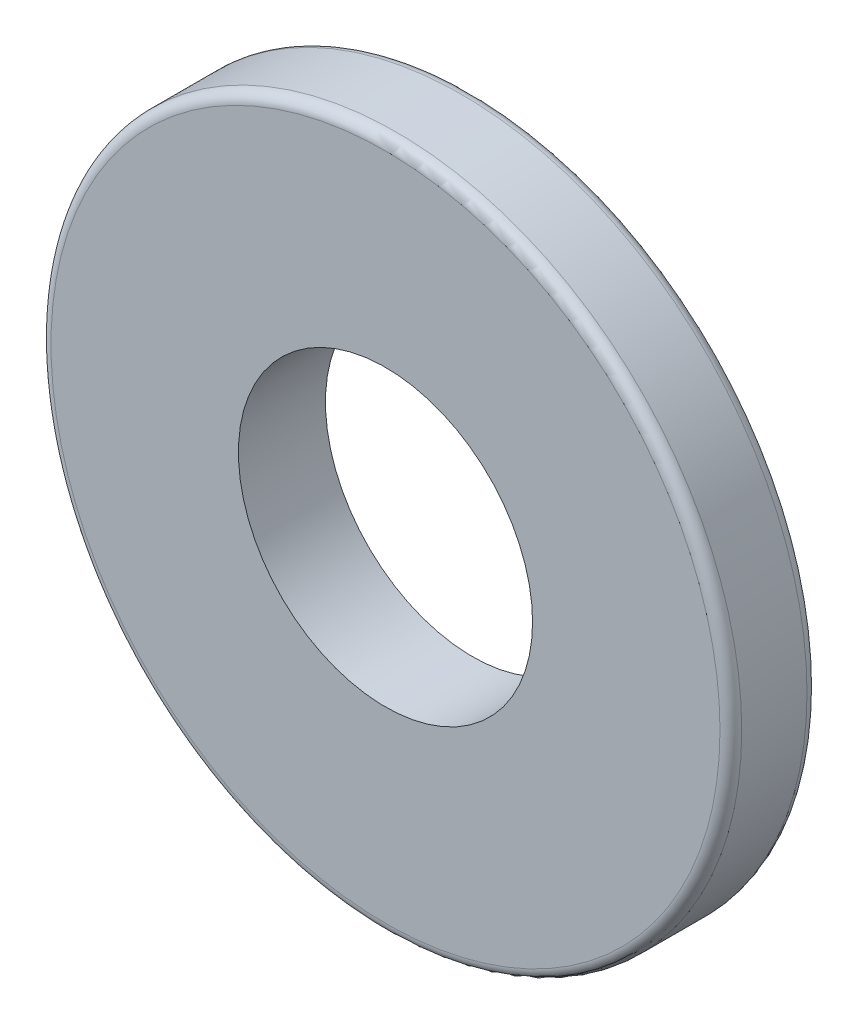
ISO-10303-21;
HEADER;
FILE_DESCRIPTION(('STEP AP214'),'2;1');
FILE_NAME('part.step','',(''),(''),'','','');
FILE_SCHEMA(('AUTOMOTIVE_DESIGN { 1 0 10303 214 1 1 1 1 }'));
ENDSEC;
DATA;
#1=APPLICATION_CONTEXT('core data for automotive mechanical design processes');
#2=APPLICATION_PROTOCOL_DEFINITION('international standard','automotive_design',2000,#1);
#3=PRODUCT_CONTEXT('',#1,'mechanical');
#4=PRODUCT('Part','Part','',(#3));
#5=PRODUCT_RELATED_PRODUCT_CATEGORY('part','',(#4));
#6=PRODUCT_DEFINITION_FORMATION('','',#4);
#7=PRODUCT_DEFINITION_CONTEXT('part definition',#1,'design');
#8=PRODUCT_DEFINITION('design','',#6,#7);
#9=PRODUCT_DEFINITION_SHAPE('','',#8);
#10=(LENGTH_UNIT() NAMED_UNIT(*) SI_UNIT(.MILLI.,.METRE.));
#11=(NAMED_UNIT(*) PLANE_ANGLE_UNIT() SI_UNIT($,.RADIAN.));
#12=(NAMED_UNIT(*) SI_UNIT($,.STERADIAN.) SOLID_ANGLE_UNIT());
#13=UNCERTAINTY_MEASURE_WITH_UNIT(LENGTH_MEASURE(1.E-05),#10,'distance_accuracy_value','');
#14=(GEOMETRIC_REPRESENTATION_CONTEXT(3) GLOBAL_UNCERTAINTY_ASSIGNED_CONTEXT((#13)) GLOBAL_UNIT_ASSIGNED_CONTEXT((#10,
#11,#12)) REPRESENTATION_CONTEXT('',''));
#15=CARTESIAN_POINT('',(0.,0.,0.));
#16=DIRECTION('',(0.,0.,1.));
#17=DIRECTION('',(1.,0.,0.));
#18=AXIS2_PLACEMENT_3D('',#15,#16,#17);
#19=CARTESIAN_POINT('',(0.,0.,2.));
#20=DIRECTION('',(0.,0.,1.));
#21=DIRECTION('',(1.,0.,0.));
#22=AXIS2_PLACEMENT_3D('',#19,#20,#21);
#23=PLANE('',#22);
#24=CARTESIAN_POINT('',(0.,0.,2.));
#25=DIRECTION('',(0.,0.,1.));
#26=DIRECTION('',(1.,0.,0.));
#27=AXIS2_PLACEMENT_3D('',#24,#25,#26);
#28=CIRCLE('',#27,7.6875);
#29=CARTESIAN_POINT('',(7.6875,0.,2.));
#30=VERTEX_POINT('',#29);
#31=EDGE_CURVE('E10',#30,#30,#28,.T.);
#32=ORIENTED_EDGE('',*,*,#31,.T.);
#33=EDGE_LOOP('',(#32));
#34=FACE_BOUND('',#33,.T.);
#35=CARTESIAN_POINT('',(0.,0.,2.));
#36=DIRECTION('',(0.,0.,1.));
#37=DIRECTION('',(1.,0.,0.));
#38=AXIS2_PLACEMENT_3D('',#35,#36,#37);
#39=CIRCLE('',#38,3.38);
#40=CARTESIAN_POINT('',(3.38,0.,2.));
#41=VERTEX_POINT('',#40);
#42=EDGE_CURVE('E67',#41,#41,#39,.T.);
#43=ORIENTED_EDGE('',*,*,#42,.F.);
#44=EDGE_LOOP('',(#43));
#45=FACE_BOUND('',#44,.T.);
#46=ADVANCED_FACE('F43',(#34,#45),#23,.T.);
#47=CARTESIAN_POINT('',(0.,0.,0.));
#48=DIRECTION('',(0.,0.,1.));
#49=DIRECTION('',(1.,0.,0.));
#50=AXIS2_PLACEMENT_3D('',#47,#48,#49);
#51=PLANE('',#50);
#52=CARTESIAN_POINT('',(0.,0.,0.));
#53=DIRECTION('',(0.,0.,1.));
#54=DIRECTION('',(1.,0.,0.));
#55=AXIS2_PLACEMENT_3D('',#52,#53,#54);
#56=CIRCLE('',#55,7.6875);
#57=CARTESIAN_POINT('',(7.6875,0.,0.));
#58=VERTEX_POINT('',#57);
#59=EDGE_CURVE('E51',#58,#58,#56,.F.);
#60=ORIENTED_EDGE('',*,*,#59,.T.);
#61=EDGE_LOOP('',(#60));
#62=FACE_BOUND('',#61,.T.);
#63=CARTESIAN_POINT('',(0.,0.,0.));
#64=DIRECTION('',(0.,0.,1.));
#65=DIRECTION('',(1.,0.,0.));
#66=AXIS2_PLACEMENT_3D('',#63,#64,#65);
#67=CIRCLE('',#66,3.38);
#68=CARTESIAN_POINT('',(3.38,0.,0.));
#69=VERTEX_POINT('',#68);
#70=EDGE_CURVE('E68',#69,#69,#67,.T.);
#71=ORIENTED_EDGE('',*,*,#70,.T.);
#72=EDGE_LOOP('',(#71));
#73=FACE_BOUND('',#72,.T.);
#74=ADVANCED_FACE('F80',(#62,#73),#51,.F.);
#75=CARTESIAN_POINT('',(0.,0.,2.));
#76=DIRECTION('',(0.,0.,-1.));
#77=DIRECTION('',(-1.,0.,0.));
#78=AXIS2_PLACEMENT_3D('',#75,#76,#77);
#79=CYLINDRICAL_SURFACE('',#78,7.9375);
#80=CARTESIAN_POINT('',(0.,0.,0.25));
#81=DIRECTION('',(0.,0.,1.));
#82=DIRECTION('',(1.,0.,0.));
#83=AXIS2_PLACEMENT_3D('',#80,#81,#82);
#84=CIRCLE('',#83,7.9375);
#85=CARTESIAN_POINT('',(7.9375,0.,0.25));
#86=VERTEX_POINT('',#85);
#87=EDGE_CURVE('E56',#86,#86,#84,.T.);
#88=ORIENTED_EDGE('',*,*,#87,.T.);
#89=EDGE_LOOP('',(#88));
#90=FACE_BOUND('',#89,.T.);
#91=CARTESIAN_POINT('',(0.,0.,1.75));
#92=DIRECTION('',(0.,0.,1.));
#93=DIRECTION('',(1.,0.,0.));
#94=AXIS2_PLACEMENT_3D('',#91,#92,#93);
#95=CIRCLE('',#94,7.9375);
#96=CARTESIAN_POINT('',(7.9375,0.,1.75));
#97=VERTEX_POINT('',#96);
#98=EDGE_CURVE('E61',#97,#97,#95,.F.);
#99=ORIENTED_EDGE('',*,*,#98,.T.);
#100=EDGE_LOOP('',(#99));
#101=FACE_BOUND('',#100,.T.);
#102=ADVANCED_FACE('F86',(#90,#101),#79,.T.);
#103=CARTESIAN_POINT('',(0.,0.,2.));
#104=DIRECTION('',(0.,0.,-1.));
#105=DIRECTION('',(-1.,0.,0.));
#106=AXIS2_PLACEMENT_3D('',#103,#104,#105);
#107=CYLINDRICAL_SURFACE('',#106,3.38);
#108=ORIENTED_EDGE('',*,*,#42,.T.);
#109=EDGE_LOOP('',(#108));
#110=FACE_BOUND('',#109,.T.);
#111=ORIENTED_EDGE('',*,*,#70,.F.);
#112=EDGE_LOOP('',(#111));
#113=FACE_BOUND('',#112,.T.);
#114=ADVANCED_FACE('F76',(#110,#113),#107,.F.);
#115=CARTESIAN_POINT('',(0.,0.,0.25));
#116=DIRECTION('',(0.,0.,1.));
#117=DIRECTION('',(1.,0.,0.));
#118=AXIS2_PLACEMENT_3D('',#115,#116,#117);
#119=TOROIDAL_SURFACE('',#118,7.6875,0.25);
#120=ORIENTED_EDGE('',*,*,#59,.F.);
#121=EDGE_LOOP('',(#120));
#122=FACE_BOUND('',#121,.T.);
#123=ORIENTED_EDGE('',*,*,#87,.F.);
#124=EDGE_LOOP('',(#123));
#125=FACE_BOUND('',#124,.T.);
#126=ADVANCED_FACE('F92',(#122,#125),#119,.T.);
#127=CARTESIAN_POINT('',(0.,0.,1.75));
#128=DIRECTION('',(0.,0.,1.));
#129=DIRECTION('',(1.,0.,0.));
#130=AXIS2_PLACEMENT_3D('',#127,#128,#129);
#131=TOROIDAL_SURFACE('',#130,7.6875,0.25);
#132=ORIENTED_EDGE('',*,*,#98,.F.);
#133=EDGE_LOOP('',(#132));
#134=FACE_BOUND('',#133,.T.);
#135=ORIENTED_EDGE('',*,*,#31,.F.);
#136=EDGE_LOOP('',(#135));
#137=FACE_BOUND('',#136,.T.);
#138=ADVANCED_FACE('F45',(#134,#137),#131,.T.);
#139=CLOSED_SHELL('',(#46,#74,#102,#114,#126,#138));
#140=MANIFOLD_SOLID_BREP('B2',#139);
#141=ADVANCED_BREP_SHAPE_REPRESENTATION('',(#18,#140),#14);
#142=SHAPE_DEFINITION_REPRESENTATION(#9,#141);
ENDSEC;
END-ISO-10303-21;
